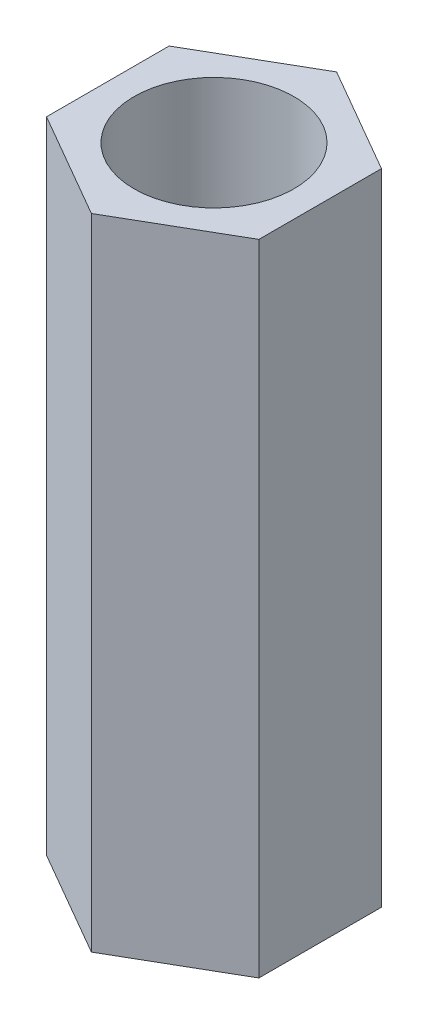
ISO-10303-21;
HEADER;
FILE_DESCRIPTION(('STEP AP214'),'2;1');
FILE_NAME('part.step','',(''),(''),'','','');
FILE_SCHEMA(('AUTOMOTIVE_DESIGN { 1 0 10303 214 1 1 1 1 }'));
ENDSEC;
DATA;
#1=APPLICATION_CONTEXT('core data for automotive mechanical design processes');
#2=APPLICATION_PROTOCOL_DEFINITION('international standard','automotive_design',2000,#1);
#3=PRODUCT_CONTEXT('',#1,'mechanical');
#4=PRODUCT('Part','Part','',(#3));
#5=PRODUCT_RELATED_PRODUCT_CATEGORY('part','',(#4));
#6=PRODUCT_DEFINITION_FORMATION('','',#4);
#7=PRODUCT_DEFINITION_CONTEXT('part definition',#1,'design');
#8=PRODUCT_DEFINITION('design','',#6,#7);
#9=PRODUCT_DEFINITION_SHAPE('','',#8);
#10=(LENGTH_UNIT() NAMED_UNIT(*) SI_UNIT(.MILLI.,.METRE.));
#11=(NAMED_UNIT(*) PLANE_ANGLE_UNIT() SI_UNIT($,.RADIAN.));
#12=(NAMED_UNIT(*) SI_UNIT($,.STERADIAN.) SOLID_ANGLE_UNIT());
#13=UNCERTAINTY_MEASURE_WITH_UNIT(LENGTH_MEASURE(1.E-05),#10,'distance_accuracy_value','');
#14=(GEOMETRIC_REPRESENTATION_CONTEXT(3) GLOBAL_UNCERTAINTY_ASSIGNED_CONTEXT((#13)) GLOBAL_UNIT_ASSIGNED_CONTEXT((#10,
#11,#12)) REPRESENTATION_CONTEXT('',''));
#15=CARTESIAN_POINT('',(0.,0.,0.));
#16=DIRECTION('',(0.,0.,1.));
#17=DIRECTION('',(1.,0.,0.));
#18=AXIS2_PLACEMENT_3D('',#15,#16,#17);
#19=CARTESIAN_POINT('',(0.,12.,0.));
#20=DIRECTION('',(0.,1.,0.));
#21=DIRECTION('',(0.,0.,1.));
#22=AXIS2_PLACEMENT_3D('',#19,#20,#21);
#23=PLANE('',#22);
#24=DIRECTION('',(0.,0.,-1.));
#25=VECTOR('',#24,1.);
#26=CARTESIAN_POINT('',(1.99185842870422,12.,1.14999999999998));
#27=LINE('',#26,#25);
#28=CARTESIAN_POINT('',(1.99185842870422,12.,1.14999999999998));
#29=VERTEX_POINT('',#28);
#30=CARTESIAN_POINT('',(1.9918584287042,12.,-1.15000000000002));
#31=VERTEX_POINT('',#30);
#32=EDGE_CURVE('E150',#29,#31,#27,.T.);
#33=ORIENTED_EDGE('',*,*,#32,.T.);
#34=DIRECTION('',(-0.866025403784443,0.,-0.499999999999992));
#35=VECTOR('',#34,1.);
#36=CARTESIAN_POINT('',(1.9918584287042,12.,-1.15000000000002));
#37=LINE('',#36,#35);
#38=CARTESIAN_POINT('',(0.,12.,-2.3));
#39=VERTEX_POINT('',#38);
#40=EDGE_CURVE('E98',#31,#39,#37,.T.);
#41=ORIENTED_EDGE('',*,*,#40,.T.);
#42=DIRECTION('',(-0.866025403784434,0.,0.500000000000008));
#43=VECTOR('',#42,1.);
#44=CARTESIAN_POINT('',(0.,12.,-2.3));
#45=LINE('',#44,#43);
#46=CARTESIAN_POINT('',(-1.99185842870422,12.,-1.14999999999998));
#47=VERTEX_POINT('',#46);
#48=EDGE_CURVE('E111',#39,#47,#45,.T.);
#49=ORIENTED_EDGE('',*,*,#48,.T.);
#50=DIRECTION('',(0.,0.,1.));
#51=VECTOR('',#50,1.);
#52=CARTESIAN_POINT('',(-1.99185842870422,12.,-1.14999999999998));
#53=LINE('',#52,#51);
#54=CARTESIAN_POINT('',(-1.9918584287042,12.,1.15000000000002));
#55=VERTEX_POINT('',#54);
#56=EDGE_CURVE('E105',#47,#55,#53,.T.);
#57=ORIENTED_EDGE('',*,*,#56,.T.);
#58=DIRECTION('',(0.866025403784443,0.,0.499999999999992));
#59=VECTOR('',#58,1.);
#60=CARTESIAN_POINT('',(-1.9918584287042,12.,1.15000000000002));
#61=LINE('',#60,#59);
#62=CARTESIAN_POINT('',(0.,12.,2.3));
#63=VERTEX_POINT('',#62);
#64=EDGE_CURVE('E109',#55,#63,#61,.T.);
#65=ORIENTED_EDGE('',*,*,#64,.T.);
#66=DIRECTION('',(0.866025403784434,0.,-0.500000000000008));
#67=VECTOR('',#66,1.);
#68=CARTESIAN_POINT('',(0.,12.,2.3));
#69=LINE('',#68,#67);
#70=EDGE_CURVE('E61',#63,#29,#69,.T.);
#71=ORIENTED_EDGE('',*,*,#70,.T.);
#72=EDGE_LOOP('',(#33,#41,#49,#57,#65,#71));
#73=FACE_BOUND('',#72,.T.);
#74=CARTESIAN_POINT('',(0.,12.,0.));
#75=DIRECTION('',(0.,1.,0.));
#76=DIRECTION('',(0.,0.,1.));
#77=AXIS2_PLACEMENT_3D('',#74,#75,#76);
#78=CIRCLE('',#77,1.5);
#79=CARTESIAN_POINT('',(0.,12.,1.5));
#80=VERTEX_POINT('',#79);
#81=EDGE_CURVE('E138',#80,#80,#78,.T.);
#82=ORIENTED_EDGE('',*,*,#81,.F.);
#83=EDGE_LOOP('',(#82));
#84=FACE_BOUND('',#83,.T.);
#85=ADVANCED_FACE('F43',(#73,#84),#23,.T.);
#86=CARTESIAN_POINT('',(0.,0.,0.));
#87=DIRECTION('',(0.,1.,0.));
#88=DIRECTION('',(0.,0.,1.));
#89=AXIS2_PLACEMENT_3D('',#86,#87,#88);
#90=PLANE('',#89);
#91=DIRECTION('',(0.,0.,-1.));
#92=VECTOR('',#91,1.);
#93=CARTESIAN_POINT('',(1.99185842870422,0.,1.14999999999998));
#94=LINE('',#93,#92);
#95=CARTESIAN_POINT('',(1.99185842870422,0.,1.14999999999998));
#96=VERTEX_POINT('',#95);
#97=CARTESIAN_POINT('',(1.9918584287042,0.,-1.15000000000002));
#98=VERTEX_POINT('',#97);
#99=EDGE_CURVE('E133',#96,#98,#94,.T.);
#100=ORIENTED_EDGE('',*,*,#99,.F.);
#101=DIRECTION('',(0.866025403784434,0.,-0.500000000000008));
#102=VECTOR('',#101,1.);
#103=CARTESIAN_POINT('',(0.,0.,2.3));
#104=LINE('',#103,#102);
#105=CARTESIAN_POINT('',(0.,0.,2.3));
#106=VERTEX_POINT('',#105);
#107=EDGE_CURVE('E90',#106,#96,#104,.T.);
#108=ORIENTED_EDGE('',*,*,#107,.F.);
#109=DIRECTION('',(0.866025403784443,0.,0.499999999999992));
#110=VECTOR('',#109,1.);
#111=CARTESIAN_POINT('',(-1.9918584287042,0.,1.15000000000002));
#112=LINE('',#111,#110);
#113=CARTESIAN_POINT('',(-1.9918584287042,0.,1.15000000000002));
#114=VERTEX_POINT('',#113);
#115=EDGE_CURVE('E84',#114,#106,#112,.T.);
#116=ORIENTED_EDGE('',*,*,#115,.F.);
#117=DIRECTION('',(0.,0.,1.));
#118=VECTOR('',#117,1.);
#119=CARTESIAN_POINT('',(-1.99185842870422,0.,-1.14999999999998));
#120=LINE('',#119,#118);
#121=CARTESIAN_POINT('',(-1.99185842870422,0.,-1.14999999999998));
#122=VERTEX_POINT('',#121);
#123=EDGE_CURVE('E120',#122,#114,#120,.T.);
#124=ORIENTED_EDGE('',*,*,#123,.F.);
#125=DIRECTION('',(-0.866025403784434,0.,0.500000000000008));
#126=VECTOR('',#125,1.);
#127=CARTESIAN_POINT('',(0.,0.,-2.3));
#128=LINE('',#127,#126);
#129=CARTESIAN_POINT('',(0.,0.,-2.3));
#130=VERTEX_POINT('',#129);
#131=EDGE_CURVE('E141',#130,#122,#128,.T.);
#132=ORIENTED_EDGE('',*,*,#131,.F.);
#133=DIRECTION('',(-0.866025403784443,0.,-0.499999999999992));
#134=VECTOR('',#133,1.);
#135=CARTESIAN_POINT('',(1.9918584287042,0.,-1.15000000000002));
#136=LINE('',#135,#134);
#137=EDGE_CURVE('E137',#98,#130,#136,.T.);
#138=ORIENTED_EDGE('',*,*,#137,.F.);
#139=EDGE_LOOP('',(#100,#108,#116,#124,#132,#138));
#140=FACE_BOUND('',#139,.T.);
#141=CARTESIAN_POINT('',(0.,0.,0.));
#142=DIRECTION('',(0.,1.,0.));
#143=DIRECTION('',(0.,0.,1.));
#144=AXIS2_PLACEMENT_3D('',#141,#142,#143);
#145=CIRCLE('',#144,1.5);
#146=CARTESIAN_POINT('',(0.,0.,1.5));
#147=VERTEX_POINT('',#146);
#148=EDGE_CURVE('E265',#147,#147,#145,.T.);
#149=ORIENTED_EDGE('',*,*,#148,.T.);
#150=EDGE_LOOP('',(#149));
#151=FACE_BOUND('',#150,.T.);
#152=ADVANCED_FACE('F163',(#140,#151),#90,.F.);
#153=CARTESIAN_POINT('',(1.99185842870422,12.,1.14999999999998));
#154=DIRECTION('',(-1.,0.,0.));
#155=DIRECTION('',(0.,0.,1.));
#156=AXIS2_PLACEMENT_3D('',#153,#154,#155);
#157=PLANE('',#156);
#158=ORIENTED_EDGE('',*,*,#99,.T.);
#159=DIRECTION('',(0.,-1.,0.));
#160=VECTOR('',#159,1.);
#161=CARTESIAN_POINT('',(1.9918584287042,12.,-1.15000000000002));
#162=LINE('',#161,#160);
#163=EDGE_CURVE('E11',#31,#98,#162,.T.);
#164=ORIENTED_EDGE('',*,*,#163,.F.);
#165=ORIENTED_EDGE('',*,*,#32,.F.);
#166=DIRECTION('',(0.,-1.,0.));
#167=VECTOR('',#166,1.);
#168=CARTESIAN_POINT('',(1.99185842870422,12.,1.14999999999998));
#169=LINE('',#168,#167);
#170=EDGE_CURVE('E129',#29,#96,#169,.T.);
#171=ORIENTED_EDGE('',*,*,#170,.T.);
#172=EDGE_LOOP('',(#158,#164,#165,#171));
#173=FACE_BOUND('',#172,.T.);
#174=ADVANCED_FACE('F45',(#173),#157,.F.);
#175=CARTESIAN_POINT('',(1.9918584287042,12.,-1.15000000000002));
#176=DIRECTION('',(-0.499999999999992,0.,0.866025403784443));
#177=DIRECTION('',(0.866025403784443,0.,0.499999999999992));
#178=AXIS2_PLACEMENT_3D('',#175,#176,#177);
#179=PLANE('',#178);
#180=ORIENTED_EDGE('',*,*,#137,.T.);
#181=DIRECTION('',(0.,-1.,0.));
#182=VECTOR('',#181,1.);
#183=CARTESIAN_POINT('',(0.,12.,-2.3));
#184=LINE('',#183,#182);
#185=EDGE_CURVE('E53',#39,#130,#184,.T.);
#186=ORIENTED_EDGE('',*,*,#185,.F.);
#187=ORIENTED_EDGE('',*,*,#40,.F.);
#188=ORIENTED_EDGE('',*,*,#163,.T.);
#189=EDGE_LOOP('',(#180,#186,#187,#188));
#190=FACE_BOUND('',#189,.T.);
#191=ADVANCED_FACE('F188',(#190),#179,.F.);
#192=CARTESIAN_POINT('',(0.,12.,-2.3));
#193=DIRECTION('',(0.500000000000008,0.,0.866025403784434));
#194=DIRECTION('',(0.866025403784434,0.,-0.500000000000008));
#195=AXIS2_PLACEMENT_3D('',#192,#193,#194);
#196=PLANE('',#195);
#197=ORIENTED_EDGE('',*,*,#131,.T.);
#198=DIRECTION('',(0.,-1.,0.));
#199=VECTOR('',#198,1.);
#200=CARTESIAN_POINT('',(-1.99185842870422,12.,-1.14999999999998));
#201=LINE('',#200,#199);
#202=EDGE_CURVE('E122',#47,#122,#201,.T.);
#203=ORIENTED_EDGE('',*,*,#202,.F.);
#204=ORIENTED_EDGE('',*,*,#48,.F.);
#205=ORIENTED_EDGE('',*,*,#185,.T.);
#206=EDGE_LOOP('',(#197,#203,#204,#205));
#207=FACE_BOUND('',#206,.T.);
#208=ADVANCED_FACE('F160',(#207),#196,.F.);
#209=CARTESIAN_POINT('',(-1.99185842870422,12.,-1.14999999999998));
#210=DIRECTION('',(1.,0.,0.));
#211=DIRECTION('',(0.,0.,-1.));
#212=AXIS2_PLACEMENT_3D('',#209,#210,#211);
#213=PLANE('',#212);
#214=ORIENTED_EDGE('',*,*,#123,.T.);
#215=DIRECTION('',(0.,-1.,0.));
#216=VECTOR('',#215,1.);
#217=CARTESIAN_POINT('',(-1.9918584287042,12.,1.15000000000002));
#218=LINE('',#217,#216);
#219=EDGE_CURVE('E117',#55,#114,#218,.T.);
#220=ORIENTED_EDGE('',*,*,#219,.F.);
#221=ORIENTED_EDGE('',*,*,#56,.F.);
#222=ORIENTED_EDGE('',*,*,#202,.T.);
#223=EDGE_LOOP('',(#214,#220,#221,#222));
#224=FACE_BOUND('',#223,.T.);
#225=ADVANCED_FACE('F118',(#224),#213,.F.);
#226=CARTESIAN_POINT('',(-1.9918584287042,12.,1.15000000000002));
#227=DIRECTION('',(0.499999999999992,0.,-0.866025403784443));
#228=DIRECTION('',(-0.866025403784443,0.,-0.499999999999992));
#229=AXIS2_PLACEMENT_3D('',#226,#227,#228);
#230=PLANE('',#229);
#231=ORIENTED_EDGE('',*,*,#115,.T.);
#232=DIRECTION('',(0.,-1.,0.));
#233=VECTOR('',#232,1.);
#234=CARTESIAN_POINT('',(0.,12.,2.3));
#235=LINE('',#234,#233);
#236=EDGE_CURVE('E123',#63,#106,#235,.T.);
#237=ORIENTED_EDGE('',*,*,#236,.F.);
#238=ORIENTED_EDGE('',*,*,#64,.F.);
#239=ORIENTED_EDGE('',*,*,#219,.T.);
#240=EDGE_LOOP('',(#231,#237,#238,#239));
#241=FACE_BOUND('',#240,.T.);
#242=ADVANCED_FACE('F125',(#241),#230,.F.);
#243=CARTESIAN_POINT('',(0.,12.,2.3));
#244=DIRECTION('',(-0.500000000000008,0.,-0.866025403784434));
#245=DIRECTION('',(-0.866025403784434,0.,0.500000000000008));
#246=AXIS2_PLACEMENT_3D('',#243,#244,#245);
#247=PLANE('',#246);
#248=ORIENTED_EDGE('',*,*,#107,.T.);
#249=ORIENTED_EDGE('',*,*,#170,.F.);
#250=ORIENTED_EDGE('',*,*,#70,.F.);
#251=ORIENTED_EDGE('',*,*,#236,.T.);
#252=EDGE_LOOP('',(#248,#249,#250,#251));
#253=FACE_BOUND('',#252,.T.);
#254=ADVANCED_FACE('F168',(#253),#247,.F.);
#255=CARTESIAN_POINT('',(0.,12.,0.));
#256=DIRECTION('',(0.,-1.,0.));
#257=DIRECTION('',(0.,0.,-1.));
#258=AXIS2_PLACEMENT_3D('',#255,#256,#257);
#259=CYLINDRICAL_SURFACE('',#258,1.5);
#260=ORIENTED_EDGE('',*,*,#81,.T.);
#261=EDGE_LOOP('',(#260));
#262=FACE_BOUND('',#261,.T.);
#263=ORIENTED_EDGE('',*,*,#148,.F.);
#264=EDGE_LOOP('',(#263));
#265=FACE_BOUND('',#264,.T.);
#266=ADVANCED_FACE('F170',(#262,#265),#259,.F.);
#267=CLOSED_SHELL('',(#85,#152,#174,#191,#208,#225,#242,#254,#266));
#268=MANIFOLD_SOLID_BREP('B2',#267);
#269=ADVANCED_BREP_SHAPE_REPRESENTATION('',(#18,#268),#14);
#270=SHAPE_DEFINITION_REPRESENTATION(#9,#269);
ENDSEC;
END-ISO-10303-21;
